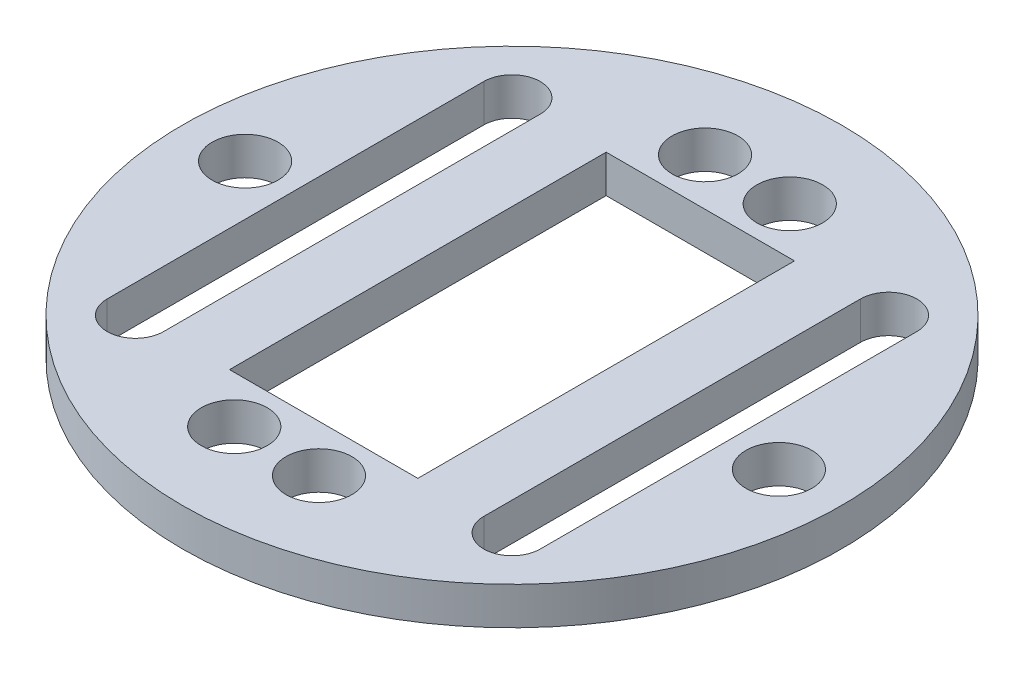
ISO-10303-21;
HEADER;
FILE_DESCRIPTION(('STEP AP214'),'2;1');
FILE_NAME('part.step','',(''),(''),'','','');
FILE_SCHEMA(('AUTOMOTIVE_DESIGN { 1 0 10303 214 1 1 1 1 }'));
ENDSEC;
DATA;
#1=APPLICATION_CONTEXT('core data for automotive mechanical design processes');
#2=APPLICATION_PROTOCOL_DEFINITION('international standard','automotive_design',2000,#1);
#3=PRODUCT_CONTEXT('',#1,'mechanical');
#4=PRODUCT('Part','Part','',(#3));
#5=PRODUCT_RELATED_PRODUCT_CATEGORY('part','',(#4));
#6=PRODUCT_DEFINITION_FORMATION('','',#4);
#7=PRODUCT_DEFINITION_CONTEXT('part definition',#1,'design');
#8=PRODUCT_DEFINITION('design','',#6,#7);
#9=PRODUCT_DEFINITION_SHAPE('','',#8);
#10=(LENGTH_UNIT() NAMED_UNIT(*) SI_UNIT(.MILLI.,.METRE.));
#11=(NAMED_UNIT(*) PLANE_ANGLE_UNIT() SI_UNIT($,.RADIAN.));
#12=(NAMED_UNIT(*) SI_UNIT($,.STERADIAN.) SOLID_ANGLE_UNIT());
#13=UNCERTAINTY_MEASURE_WITH_UNIT(LENGTH_MEASURE(1.E-05),#10,'distance_accuracy_value','');
#14=(GEOMETRIC_REPRESENTATION_CONTEXT(3) GLOBAL_UNCERTAINTY_ASSIGNED_CONTEXT((#13)) GLOBAL_UNIT_ASSIGNED_CONTEXT((#10,
#11,#12)) REPRESENTATION_CONTEXT('',''));
#15=CARTESIAN_POINT('',(0.,0.,0.));
#16=DIRECTION('',(0.,0.,1.));
#17=DIRECTION('',(1.,0.,0.));
#18=AXIS2_PLACEMENT_3D('',#15,#16,#17);
#19=CARTESIAN_POINT('',(0.,4.,0.));
#20=DIRECTION('',(0.,1.,0.));
#21=DIRECTION('',(0.,0.,1.));
#22=AXIS2_PLACEMENT_3D('',#19,#20,#21);
#23=PLANE('',#22);
#24=DIRECTION('',(0.,0.,1.));
#25=VECTOR('',#24,1.);
#26=CARTESIAN_POINT('',(10.,4.,0.));
#27=LINE('',#26,#25);
#28=CARTESIAN_POINT('',(10.,4.,-20.));
#29=VERTEX_POINT('',#28);
#30=CARTESIAN_POINT('',(10.,4.,20.));
#31=VERTEX_POINT('',#30);
#32=EDGE_CURVE('E232',#29,#31,#27,.T.);
#33=ORIENTED_EDGE('',*,*,#32,.T.);
#34=DIRECTION('',(-1.,0.,0.));
#35=VECTOR('',#34,1.);
#36=CARTESIAN_POINT('',(0.,4.,20.));
#37=LINE('',#36,#35);
#38=CARTESIAN_POINT('',(-9.99999999999999,4.,20.));
#39=VERTEX_POINT('',#38);
#40=EDGE_CURVE('E235',#31,#39,#37,.T.);
#41=ORIENTED_EDGE('',*,*,#40,.T.);
#42=DIRECTION('',(0.,0.,1.));
#43=VECTOR('',#42,1.);
#44=CARTESIAN_POINT('',(-9.99999999999999,4.,0.));
#45=LINE('',#44,#43);
#46=CARTESIAN_POINT('',(-9.99999999999999,4.,-20.));
#47=VERTEX_POINT('',#46);
#48=EDGE_CURVE('E229',#47,#39,#45,.T.);
#49=ORIENTED_EDGE('',*,*,#48,.F.);
#50=DIRECTION('',(-1.,0.,0.));
#51=VECTOR('',#50,1.);
#52=CARTESIAN_POINT('',(0.,4.,-20.));
#53=LINE('',#52,#51);
#54=EDGE_CURVE('E126',#29,#47,#53,.T.);
#55=ORIENTED_EDGE('',*,*,#54,.F.);
#56=EDGE_LOOP('',(#33,#41,#49,#55));
#57=FACE_BOUND('',#56,.T.);
#58=CARTESIAN_POINT('',(4.5,4.,25.));
#59=DIRECTION('',(0.,1.,0.));
#60=DIRECTION('',(0.,0.,1.));
#61=AXIS2_PLACEMENT_3D('',#58,#59,#60);
#62=CIRCLE('',#61,3.5);
#63=CARTESIAN_POINT('',(4.5,4.,28.5));
#64=VERTEX_POINT('',#63);
#65=EDGE_CURVE('E211',#64,#64,#62,.F.);
#66=ORIENTED_EDGE('',*,*,#65,.T.);
#67=EDGE_LOOP('',(#66));
#68=FACE_BOUND('',#67,.T.);
#69=DIRECTION('',(0.,0.,-1.));
#70=VECTOR('',#69,1.);
#71=CARTESIAN_POINT('',(-23.,4.,0.));
#72=LINE('',#71,#70);
#73=CARTESIAN_POINT('',(-23.,4.,20.));
#74=VERTEX_POINT('',#73);
#75=CARTESIAN_POINT('',(-23.,4.,-20.));
#76=VERTEX_POINT('',#75);
#77=EDGE_CURVE('E199',#74,#76,#72,.T.);
#78=ORIENTED_EDGE('',*,*,#77,.T.);
#79=CARTESIAN_POINT('',(-20.,4.,-20.));
#80=DIRECTION('',(0.,1.,0.));
#81=DIRECTION('',(0.,0.,1.));
#82=AXIS2_PLACEMENT_3D('',#79,#80,#81);
#83=CIRCLE('',#82,3.);
#84=CARTESIAN_POINT('',(-17.,4.,-20.));
#85=VERTEX_POINT('',#84);
#86=EDGE_CURVE('E202',#76,#85,#83,.F.);
#87=ORIENTED_EDGE('',*,*,#86,.T.);
#88=DIRECTION('',(0.,0.,-1.));
#89=VECTOR('',#88,1.);
#90=CARTESIAN_POINT('',(-17.,4.,0.));
#91=LINE('',#90,#89);
#92=CARTESIAN_POINT('',(-17.,4.,20.));
#93=VERTEX_POINT('',#92);
#94=EDGE_CURVE('E194',#93,#85,#91,.T.);
#95=ORIENTED_EDGE('',*,*,#94,.F.);
#96=CARTESIAN_POINT('',(-20.,4.,20.));
#97=DIRECTION('',(0.,1.,0.));
#98=DIRECTION('',(0.,0.,1.));
#99=AXIS2_PLACEMENT_3D('',#96,#97,#98);
#100=CIRCLE('',#99,3.);
#101=EDGE_CURVE('E196',#93,#74,#100,.F.);
#102=ORIENTED_EDGE('',*,*,#101,.T.);
#103=EDGE_LOOP('',(#78,#87,#95,#102));
#104=FACE_BOUND('',#103,.T.);
#105=CARTESIAN_POINT('',(0.,4.,0.));
#106=DIRECTION('',(0.,1.,0.));
#107=DIRECTION('',(0.,0.,1.));
#108=AXIS2_PLACEMENT_3D('',#105,#106,#107);
#109=CIRCLE('',#108,35.);
#110=CARTESIAN_POINT('',(0.,4.,35.));
#111=VERTEX_POINT('',#110);
#112=EDGE_CURVE('E11',#111,#111,#109,.T.);
#113=ORIENTED_EDGE('',*,*,#112,.T.);
#114=EDGE_LOOP('',(#113));
#115=FACE_BOUND('',#114,.T.);
#116=CARTESIAN_POINT('',(4.5,4.,-25.));
#117=DIRECTION('',(0.,1.,0.));
#118=DIRECTION('',(0.,0.,1.));
#119=AXIS2_PLACEMENT_3D('',#116,#117,#118);
#120=CIRCLE('',#119,3.5);
#121=CARTESIAN_POINT('',(4.5,4.,-21.5));
#122=VERTEX_POINT('',#121);
#123=EDGE_CURVE('E205',#122,#122,#120,.T.);
#124=ORIENTED_EDGE('',*,*,#123,.F.);
#125=EDGE_LOOP('',(#124));
#126=FACE_BOUND('',#125,.T.);
#127=CARTESIAN_POINT('',(-4.5,4.,-25.));
#128=DIRECTION('',(0.,1.,0.));
#129=DIRECTION('',(0.,0.,1.));
#130=AXIS2_PLACEMENT_3D('',#127,#128,#129);
#131=CIRCLE('',#130,3.5);
#132=CARTESIAN_POINT('',(-4.5,4.,-21.5));
#133=VERTEX_POINT('',#132);
#134=EDGE_CURVE('E208',#133,#133,#131,.F.);
#135=ORIENTED_EDGE('',*,*,#134,.T.);
#136=EDGE_LOOP('',(#135));
#137=FACE_BOUND('',#136,.T.);
#138=CARTESIAN_POINT('',(-4.5,4.,25.));
#139=DIRECTION('',(0.,1.,0.));
#140=DIRECTION('',(0.,0.,1.));
#141=AXIS2_PLACEMENT_3D('',#138,#139,#140);
#142=CIRCLE('',#141,3.5);
#143=CARTESIAN_POINT('',(-4.5,4.,28.5));
#144=VERTEX_POINT('',#143);
#145=EDGE_CURVE('E214',#144,#144,#142,.T.);
#146=ORIENTED_EDGE('',*,*,#145,.F.);
#147=EDGE_LOOP('',(#146));
#148=FACE_BOUND('',#147,.T.);
#149=CARTESIAN_POINT('',(28.3467060544646,4.,0.));
#150=DIRECTION('',(0.,1.,0.));
#151=DIRECTION('',(0.,0.,1.));
#152=AXIS2_PLACEMENT_3D('',#149,#150,#151);
#153=CIRCLE('',#152,3.5);
#154=CARTESIAN_POINT('',(28.3467060544646,4.,3.5));
#155=VERTEX_POINT('',#154);
#156=EDGE_CURVE('E217',#155,#155,#153,.T.);
#157=ORIENTED_EDGE('',*,*,#156,.F.);
#158=EDGE_LOOP('',(#157));
#159=FACE_BOUND('',#158,.T.);
#160=CARTESIAN_POINT('',(20.,4.,-20.));
#161=DIRECTION('',(0.,1.,0.));
#162=DIRECTION('',(0.,0.,1.));
#163=AXIS2_PLACEMENT_3D('',#160,#161,#162);
#164=CIRCLE('',#163,3.);
#165=CARTESIAN_POINT('',(23.,4.,-20.));
#166=VERTEX_POINT('',#165);
#167=CARTESIAN_POINT('',(17.,4.,-20.));
#168=VERTEX_POINT('',#167);
#169=EDGE_CURVE('E227',#166,#168,#164,.T.);
#170=ORIENTED_EDGE('',*,*,#169,.F.);
#171=DIRECTION('',(0.,0.,-1.));
#172=VECTOR('',#171,1.);
#173=CARTESIAN_POINT('',(23.,4.,0.));
#174=LINE('',#173,#172);
#175=CARTESIAN_POINT('',(23.,4.,20.));
#176=VERTEX_POINT('',#175);
#177=EDGE_CURVE('E220',#176,#166,#174,.T.);
#178=ORIENTED_EDGE('',*,*,#177,.F.);
#179=CARTESIAN_POINT('',(20.,4.,20.));
#180=DIRECTION('',(0.,1.,0.));
#181=DIRECTION('',(0.,0.,1.));
#182=AXIS2_PLACEMENT_3D('',#179,#180,#181);
#183=CIRCLE('',#182,3.);
#184=CARTESIAN_POINT('',(17.,4.,20.));
#185=VERTEX_POINT('',#184);
#186=EDGE_CURVE('E222',#185,#176,#183,.T.);
#187=ORIENTED_EDGE('',*,*,#186,.F.);
#188=DIRECTION('',(0.,0.,-1.));
#189=VECTOR('',#188,1.);
#190=CARTESIAN_POINT('',(17.,4.,0.));
#191=LINE('',#190,#189);
#192=EDGE_CURVE('E224',#185,#168,#191,.T.);
#193=ORIENTED_EDGE('',*,*,#192,.T.);
#194=EDGE_LOOP('',(#170,#178,#187,#193));
#195=FACE_BOUND('',#194,.T.);
#196=CARTESIAN_POINT('',(-28.3467060544646,4.,0.));
#197=DIRECTION('',(0.,1.,0.));
#198=DIRECTION('',(0.,0.,1.));
#199=AXIS2_PLACEMENT_3D('',#196,#197,#198);
#200=CIRCLE('',#199,3.5);
#201=CARTESIAN_POINT('',(-28.3467060544646,4.,3.5));
#202=VERTEX_POINT('',#201);
#203=EDGE_CURVE('E238',#202,#202,#200,.F.);
#204=ORIENTED_EDGE('',*,*,#203,.T.);
#205=EDGE_LOOP('',(#204));
#206=FACE_BOUND('',#205,.T.);
#207=ADVANCED_FACE('F32',(#57,#68,#104,#115,#126,#137,#148,#159,#195,#206),#23,.T.);
#208=CARTESIAN_POINT('',(0.,0.,0.));
#209=DIRECTION('',(0.,1.,0.));
#210=DIRECTION('',(0.,0.,1.));
#211=AXIS2_PLACEMENT_3D('',#208,#209,#210);
#212=PLANE('',#211);
#213=CARTESIAN_POINT('',(4.5,0.,25.));
#214=DIRECTION('',(0.,1.,0.));
#215=DIRECTION('',(0.,0.,1.));
#216=AXIS2_PLACEMENT_3D('',#213,#214,#215);
#217=CIRCLE('',#216,3.5);
#218=CARTESIAN_POINT('',(4.5,0.,28.5));
#219=VERTEX_POINT('',#218);
#220=EDGE_CURVE('E480',#219,#219,#217,.T.);
#221=ORIENTED_EDGE('',*,*,#220,.T.);
#222=EDGE_LOOP('',(#221));
#223=FACE_BOUND('',#222,.T.);
#224=CARTESIAN_POINT('',(-4.5,0.,-25.));
#225=DIRECTION('',(0.,1.,0.));
#226=DIRECTION('',(0.,0.,1.));
#227=AXIS2_PLACEMENT_3D('',#224,#225,#226);
#228=CIRCLE('',#227,3.5);
#229=CARTESIAN_POINT('',(-4.5,0.,-21.5));
#230=VERTEX_POINT('',#229);
#231=EDGE_CURVE('E478',#230,#230,#228,.T.);
#232=ORIENTED_EDGE('',*,*,#231,.T.);
#233=EDGE_LOOP('',(#232));
#234=FACE_BOUND('',#233,.T.);
#235=CARTESIAN_POINT('',(-20.,0.,-20.));
#236=DIRECTION('',(0.,1.,0.));
#237=DIRECTION('',(0.,0.,1.));
#238=AXIS2_PLACEMENT_3D('',#235,#236,#237);
#239=CIRCLE('',#238,3.);
#240=CARTESIAN_POINT('',(-17.,0.,-20.));
#241=VERTEX_POINT('',#240);
#242=CARTESIAN_POINT('',(-23.,0.,-20.));
#243=VERTEX_POINT('',#242);
#244=EDGE_CURVE('E173',#241,#243,#239,.T.);
#245=ORIENTED_EDGE('',*,*,#244,.T.);
#246=DIRECTION('',(0.,0.,1.));
#247=VECTOR('',#246,1.);
#248=CARTESIAN_POINT('',(-23.,0.,-20.));
#249=LINE('',#248,#247);
#250=CARTESIAN_POINT('',(-23.,0.,20.));
#251=VERTEX_POINT('',#250);
#252=EDGE_CURVE('E176',#243,#251,#249,.T.);
#253=ORIENTED_EDGE('',*,*,#252,.T.);
#254=CARTESIAN_POINT('',(-20.,0.,20.));
#255=DIRECTION('',(0.,1.,0.));
#256=DIRECTION('',(0.,0.,1.));
#257=AXIS2_PLACEMENT_3D('',#254,#255,#256);
#258=CIRCLE('',#257,3.);
#259=CARTESIAN_POINT('',(-17.,0.,20.));
#260=VERTEX_POINT('',#259);
#261=EDGE_CURVE('E179',#251,#260,#258,.T.);
#262=ORIENTED_EDGE('',*,*,#261,.T.);
#263=DIRECTION('',(0.,0.,1.));
#264=VECTOR('',#263,1.);
#265=CARTESIAN_POINT('',(-17.,0.,-20.));
#266=LINE('',#265,#264);
#267=EDGE_CURVE('E182',#241,#260,#266,.T.);
#268=ORIENTED_EDGE('',*,*,#267,.F.);
#269=EDGE_LOOP('',(#245,#253,#262,#268));
#270=FACE_BOUND('',#269,.T.);
#271=CARTESIAN_POINT('',(0.,0.,0.));
#272=DIRECTION('',(0.,1.,0.));
#273=DIRECTION('',(0.,0.,1.));
#274=AXIS2_PLACEMENT_3D('',#271,#272,#273);
#275=CIRCLE('',#274,35.);
#276=CARTESIAN_POINT('',(0.,0.,35.));
#277=VERTEX_POINT('',#276);
#278=EDGE_CURVE('E36',#277,#277,#275,.T.);
#279=ORIENTED_EDGE('',*,*,#278,.F.);
#280=EDGE_LOOP('',(#279));
#281=FACE_BOUND('',#280,.T.);
#282=CARTESIAN_POINT('',(4.5,0.,-25.));
#283=DIRECTION('',(0.,-1.,0.));
#284=DIRECTION('',(0.,0.,-1.));
#285=AXIS2_PLACEMENT_3D('',#282,#283,#284);
#286=CIRCLE('',#285,3.5);
#287=CARTESIAN_POINT('',(4.5,0.,-28.5));
#288=VERTEX_POINT('',#287);
#289=EDGE_CURVE('E252',#288,#288,#286,.T.);
#290=ORIENTED_EDGE('',*,*,#289,.F.);
#291=EDGE_LOOP('',(#290));
#292=FACE_BOUND('',#291,.T.);
#293=CARTESIAN_POINT('',(-4.5,0.,25.));
#294=DIRECTION('',(0.,-1.,0.));
#295=DIRECTION('',(0.,0.,-1.));
#296=AXIS2_PLACEMENT_3D('',#293,#294,#295);
#297=CIRCLE('',#296,3.5);
#298=CARTESIAN_POINT('',(-4.5,0.,21.5));
#299=VERTEX_POINT('',#298);
#300=EDGE_CURVE('E172',#299,#299,#297,.T.);
#301=ORIENTED_EDGE('',*,*,#300,.F.);
#302=EDGE_LOOP('',(#301));
#303=FACE_BOUND('',#302,.T.);
#304=CARTESIAN_POINT('',(28.3467060544646,0.,0.));
#305=DIRECTION('',(0.,-1.,0.));
#306=DIRECTION('',(0.,0.,-1.));
#307=AXIS2_PLACEMENT_3D('',#304,#305,#306);
#308=CIRCLE('',#307,3.5);
#309=CARTESIAN_POINT('',(28.3467060544646,0.,-3.5));
#310=VERTEX_POINT('',#309);
#311=EDGE_CURVE('E159',#310,#310,#308,.T.);
#312=ORIENTED_EDGE('',*,*,#311,.F.);
#313=EDGE_LOOP('',(#312));
#314=FACE_BOUND('',#313,.T.);
#315=DIRECTION('',(0.,0.,1.));
#316=VECTOR('',#315,1.);
#317=CARTESIAN_POINT('',(23.,0.,-20.));
#318=LINE('',#317,#316);
#319=CARTESIAN_POINT('',(23.,0.,-20.));
#320=VERTEX_POINT('',#319);
#321=CARTESIAN_POINT('',(23.,0.,20.));
#322=VERTEX_POINT('',#321);
#323=EDGE_CURVE('E165',#320,#322,#318,.T.);
#324=ORIENTED_EDGE('',*,*,#323,.F.);
#325=CARTESIAN_POINT('',(20.,0.,-20.));
#326=DIRECTION('',(0.,-1.,0.));
#327=DIRECTION('',(0.,0.,-1.));
#328=AXIS2_PLACEMENT_3D('',#325,#326,#327);
#329=CIRCLE('',#328,3.);
#330=CARTESIAN_POINT('',(17.,0.,-20.));
#331=VERTEX_POINT('',#330);
#332=EDGE_CURVE('E167',#331,#320,#329,.T.);
#333=ORIENTED_EDGE('',*,*,#332,.F.);
#334=DIRECTION('',(0.,0.,1.));
#335=VECTOR('',#334,1.);
#336=CARTESIAN_POINT('',(17.,0.,-20.));
#337=LINE('',#336,#335);
#338=CARTESIAN_POINT('',(17.,0.,20.));
#339=VERTEX_POINT('',#338);
#340=EDGE_CURVE('E153',#331,#339,#337,.T.);
#341=ORIENTED_EDGE('',*,*,#340,.T.);
#342=CARTESIAN_POINT('',(20.,0.,20.));
#343=DIRECTION('',(0.,-1.,0.));
#344=DIRECTION('',(0.,0.,-1.));
#345=AXIS2_PLACEMENT_3D('',#342,#343,#344);
#346=CIRCLE('',#345,3.);
#347=EDGE_CURVE('E162',#322,#339,#346,.T.);
#348=ORIENTED_EDGE('',*,*,#347,.F.);
#349=EDGE_LOOP('',(#324,#333,#341,#348));
#350=FACE_BOUND('',#349,.T.);
#351=DIRECTION('',(1.,0.,0.));
#352=VECTOR('',#351,1.);
#353=CARTESIAN_POINT('',(-9.99999999999999,0.,20.));
#354=LINE('',#353,#352);
#355=CARTESIAN_POINT('',(-9.99999999999999,0.,20.));
#356=VERTEX_POINT('',#355);
#357=CARTESIAN_POINT('',(10.,0.,20.));
#358=VERTEX_POINT('',#357);
#359=EDGE_CURVE('E144',#356,#358,#354,.T.);
#360=ORIENTED_EDGE('',*,*,#359,.T.);
#361=DIRECTION('',(0.,0.,-1.));
#362=VECTOR('',#361,1.);
#363=CARTESIAN_POINT('',(10.,0.,20.));
#364=LINE('',#363,#362);
#365=CARTESIAN_POINT('',(10.,0.,-20.));
#366=VERTEX_POINT('',#365);
#367=EDGE_CURVE('E142',#358,#366,#364,.T.);
#368=ORIENTED_EDGE('',*,*,#367,.T.);
#369=DIRECTION('',(1.,0.,0.));
#370=VECTOR('',#369,1.);
#371=CARTESIAN_POINT('',(-9.99999999999999,0.,-20.));
#372=LINE('',#371,#370);
#373=CARTESIAN_POINT('',(-9.99999999999999,0.,-20.));
#374=VERTEX_POINT('',#373);
#375=EDGE_CURVE('E123',#374,#366,#372,.T.);
#376=ORIENTED_EDGE('',*,*,#375,.F.);
#377=DIRECTION('',(0.,0.,-1.));
#378=VECTOR('',#377,1.);
#379=CARTESIAN_POINT('',(-9.99999999999999,0.,20.));
#380=LINE('',#379,#378);
#381=EDGE_CURVE('E133',#356,#374,#380,.T.);
#382=ORIENTED_EDGE('',*,*,#381,.F.);
#383=EDGE_LOOP('',(#360,#368,#376,#382));
#384=FACE_BOUND('',#383,.T.);
#385=CARTESIAN_POINT('',(-28.3467060544646,0.,0.));
#386=DIRECTION('',(0.,1.,0.));
#387=DIRECTION('',(0.,0.,1.));
#388=AXIS2_PLACEMENT_3D('',#385,#386,#387);
#389=CIRCLE('',#388,3.5);
#390=CARTESIAN_POINT('',(-28.3467060544646,0.,3.5));
#391=VERTEX_POINT('',#390);
#392=EDGE_CURVE('E149',#391,#391,#389,.T.);
#393=ORIENTED_EDGE('',*,*,#392,.T.);
#394=EDGE_LOOP('',(#393));
#395=FACE_BOUND('',#394,.T.);
#396=ADVANCED_FACE('F139',(#223,#234,#270,#281,#292,#303,#314,#350,#384,#395),#212,.F.);
#397=CARTESIAN_POINT('',(0.,4.,0.));
#398=DIRECTION('',(0.,-1.,0.));
#399=DIRECTION('',(0.,0.,-1.));
#400=AXIS2_PLACEMENT_3D('',#397,#398,#399);
#401=CYLINDRICAL_SURFACE('',#400,35.);
#402=ORIENTED_EDGE('',*,*,#112,.F.);
#403=EDGE_LOOP('',(#402));
#404=FACE_BOUND('',#403,.T.);
#405=ORIENTED_EDGE('',*,*,#278,.T.);
#406=EDGE_LOOP('',(#405));
#407=FACE_BOUND('',#406,.T.);
#408=ADVANCED_FACE('F34',(#404,#407),#401,.T.);
#409=CARTESIAN_POINT('',(-20.,5.,-20.));
#410=DIRECTION('',(0.,-1.,0.));
#411=DIRECTION('',(0.,0.,-1.));
#412=AXIS2_PLACEMENT_3D('',#409,#410,#411);
#413=CYLINDRICAL_SURFACE('',#412,3.);
#414=DIRECTION('',(0.,-1.,0.));
#415=VECTOR('',#414,1.);
#416=CARTESIAN_POINT('',(-23.,5.,-20.));
#417=LINE('',#416,#415);
#418=EDGE_CURVE('E192',#76,#243,#417,.T.);
#419=ORIENTED_EDGE('',*,*,#418,.T.);
#420=ORIENTED_EDGE('',*,*,#244,.F.);
#421=DIRECTION('',(0.,-1.,0.));
#422=VECTOR('',#421,1.);
#423=CARTESIAN_POINT('',(-17.,5.,-20.));
#424=LINE('',#423,#422);
#425=EDGE_CURVE('E185',#85,#241,#424,.T.);
#426=ORIENTED_EDGE('',*,*,#425,.F.);
#427=ORIENTED_EDGE('',*,*,#86,.F.);
#428=EDGE_LOOP('',(#419,#420,#426,#427));
#429=FACE_BOUND('',#428,.T.);
#430=ADVANCED_FACE('F292',(#429),#413,.F.);
#431=CARTESIAN_POINT('',(-23.,5.,-20.));
#432=DIRECTION('',(1.,0.,0.));
#433=DIRECTION('',(0.,0.,-1.));
#434=AXIS2_PLACEMENT_3D('',#431,#432,#433);
#435=PLANE('',#434);
#436=DIRECTION('',(0.,-1.,0.));
#437=VECTOR('',#436,1.);
#438=CARTESIAN_POINT('',(-23.,5.,20.));
#439=LINE('',#438,#437);
#440=EDGE_CURVE('E190',#74,#251,#439,.T.);
#441=ORIENTED_EDGE('',*,*,#440,.T.);
#442=ORIENTED_EDGE('',*,*,#252,.F.);
#443=ORIENTED_EDGE('',*,*,#418,.F.);
#444=ORIENTED_EDGE('',*,*,#77,.F.);
#445=EDGE_LOOP('',(#441,#442,#443,#444));
#446=FACE_BOUND('',#445,.T.);
#447=ADVANCED_FACE('F295',(#446),#435,.T.);
#448=CARTESIAN_POINT('',(-20.,5.,20.));
#449=DIRECTION('',(0.,-1.,0.));
#450=DIRECTION('',(0.,0.,-1.));
#451=AXIS2_PLACEMENT_3D('',#448,#449,#450);
#452=CYLINDRICAL_SURFACE('',#451,3.);
#453=DIRECTION('',(0.,-1.,0.));
#454=VECTOR('',#453,1.);
#455=CARTESIAN_POINT('',(-17.,5.,20.));
#456=LINE('',#455,#454);
#457=EDGE_CURVE('E188',#93,#260,#456,.T.);
#458=ORIENTED_EDGE('',*,*,#457,.T.);
#459=ORIENTED_EDGE('',*,*,#261,.F.);
#460=ORIENTED_EDGE('',*,*,#440,.F.);
#461=ORIENTED_EDGE('',*,*,#101,.F.);
#462=EDGE_LOOP('',(#458,#459,#460,#461));
#463=FACE_BOUND('',#462,.T.);
#464=ADVANCED_FACE('F299',(#463),#452,.F.);
#465=CARTESIAN_POINT('',(-17.,5.,-20.));
#466=DIRECTION('',(1.,0.,0.));
#467=DIRECTION('',(0.,0.,-1.));
#468=AXIS2_PLACEMENT_3D('',#465,#466,#467);
#469=PLANE('',#468);
#470=ORIENTED_EDGE('',*,*,#94,.T.);
#471=ORIENTED_EDGE('',*,*,#425,.T.);
#472=ORIENTED_EDGE('',*,*,#267,.T.);
#473=ORIENTED_EDGE('',*,*,#457,.F.);
#474=EDGE_LOOP('',(#470,#471,#472,#473));
#475=FACE_BOUND('',#474,.T.);
#476=ADVANCED_FACE('F303',(#475),#469,.F.);
#477=CARTESIAN_POINT('',(4.5,5.,-25.));
#478=DIRECTION('',(0.,-1.,0.));
#479=DIRECTION('',(0.,0.,-1.));
#480=AXIS2_PLACEMENT_3D('',#477,#478,#479);
#481=CYLINDRICAL_SURFACE('',#480,3.5);
#482=ORIENTED_EDGE('',*,*,#123,.T.);
#483=EDGE_LOOP('',(#482));
#484=FACE_BOUND('',#483,.T.);
#485=ORIENTED_EDGE('',*,*,#289,.T.);
#486=EDGE_LOOP('',(#485));
#487=FACE_BOUND('',#486,.T.);
#488=ADVANCED_FACE('F307',(#484,#487),#481,.F.);
#489=CARTESIAN_POINT('',(-4.5,5.,-25.));
#490=DIRECTION('',(0.,-1.,0.));
#491=DIRECTION('',(0.,0.,-1.));
#492=AXIS2_PLACEMENT_3D('',#489,#490,#491);
#493=CYLINDRICAL_SURFACE('',#492,3.5);
#494=ORIENTED_EDGE('',*,*,#134,.F.);
#495=EDGE_LOOP('',(#494));
#496=FACE_BOUND('',#495,.T.);
#497=ORIENTED_EDGE('',*,*,#231,.F.);
#498=EDGE_LOOP('',(#497));
#499=FACE_BOUND('',#498,.T.);
#500=ADVANCED_FACE('F327',(#496,#499),#493,.F.);
#501=CARTESIAN_POINT('',(4.5,5.,25.));
#502=DIRECTION('',(0.,-1.,0.));
#503=DIRECTION('',(0.,0.,-1.));
#504=AXIS2_PLACEMENT_3D('',#501,#502,#503);
#505=CYLINDRICAL_SURFACE('',#504,3.5);
#506=ORIENTED_EDGE('',*,*,#65,.F.);
#507=EDGE_LOOP('',(#506));
#508=FACE_BOUND('',#507,.T.);
#509=ORIENTED_EDGE('',*,*,#220,.F.);
#510=EDGE_LOOP('',(#509));
#511=FACE_BOUND('',#510,.T.);
#512=ADVANCED_FACE('F318',(#508,#511),#505,.F.);
#513=CARTESIAN_POINT('',(-4.5,5.,25.));
#514=DIRECTION('',(0.,-1.,0.));
#515=DIRECTION('',(0.,0.,-1.));
#516=AXIS2_PLACEMENT_3D('',#513,#514,#515);
#517=CYLINDRICAL_SURFACE('',#516,3.5);
#518=ORIENTED_EDGE('',*,*,#145,.T.);
#519=EDGE_LOOP('',(#518));
#520=FACE_BOUND('',#519,.T.);
#521=ORIENTED_EDGE('',*,*,#300,.T.);
#522=EDGE_LOOP('',(#521));
#523=FACE_BOUND('',#522,.T.);
#524=ADVANCED_FACE('F311',(#520,#523),#517,.F.);
#525=CARTESIAN_POINT('',(28.3467060544646,5.,0.));
#526=DIRECTION('',(0.,-1.,0.));
#527=DIRECTION('',(0.,0.,-1.));
#528=AXIS2_PLACEMENT_3D('',#525,#526,#527);
#529=CYLINDRICAL_SURFACE('',#528,3.5);
#530=ORIENTED_EDGE('',*,*,#156,.T.);
#531=EDGE_LOOP('',(#530));
#532=FACE_BOUND('',#531,.T.);
#533=ORIENTED_EDGE('',*,*,#311,.T.);
#534=EDGE_LOOP('',(#533));
#535=FACE_BOUND('',#534,.T.);
#536=ADVANCED_FACE('F309',(#532,#535),#529,.F.);
#537=CARTESIAN_POINT('',(20.,5.,-20.));
#538=DIRECTION('',(0.,-1.,0.));
#539=DIRECTION('',(0.,0.,-1.));
#540=AXIS2_PLACEMENT_3D('',#537,#538,#539);
#541=CYLINDRICAL_SURFACE('',#540,3.);
#542=ORIENTED_EDGE('',*,*,#169,.T.);
#543=DIRECTION('',(0.,-1.,0.));
#544=VECTOR('',#543,1.);
#545=CARTESIAN_POINT('',(17.,5.,-20.));
#546=LINE('',#545,#544);
#547=EDGE_CURVE('E157',#168,#331,#546,.T.);
#548=ORIENTED_EDGE('',*,*,#547,.T.);
#549=ORIENTED_EDGE('',*,*,#332,.T.);
#550=DIRECTION('',(0.,-1.,0.));
#551=VECTOR('',#550,1.);
#552=CARTESIAN_POINT('',(23.,5.,-20.));
#553=LINE('',#552,#551);
#554=EDGE_CURVE('E150',#166,#320,#553,.T.);
#555=ORIENTED_EDGE('',*,*,#554,.F.);
#556=EDGE_LOOP('',(#542,#548,#549,#555));
#557=FACE_BOUND('',#556,.T.);
#558=ADVANCED_FACE('F266',(#557),#541,.F.);
#559=CARTESIAN_POINT('',(17.,5.,-20.));
#560=DIRECTION('',(1.,0.,0.));
#561=DIRECTION('',(0.,0.,-1.));
#562=AXIS2_PLACEMENT_3D('',#559,#560,#561);
#563=PLANE('',#562);
#564=DIRECTION('',(0.,-1.,0.));
#565=VECTOR('',#564,1.);
#566=CARTESIAN_POINT('',(17.,5.,20.));
#567=LINE('',#566,#565);
#568=EDGE_CURVE('E155',#185,#339,#567,.T.);
#569=ORIENTED_EDGE('',*,*,#568,.T.);
#570=ORIENTED_EDGE('',*,*,#340,.F.);
#571=ORIENTED_EDGE('',*,*,#547,.F.);
#572=ORIENTED_EDGE('',*,*,#192,.F.);
#573=EDGE_LOOP('',(#569,#570,#571,#572));
#574=FACE_BOUND('',#573,.T.);
#575=ADVANCED_FACE('F272',(#574),#563,.T.);
#576=CARTESIAN_POINT('',(20.,5.,20.));
#577=DIRECTION('',(0.,-1.,0.));
#578=DIRECTION('',(0.,0.,-1.));
#579=AXIS2_PLACEMENT_3D('',#576,#577,#578);
#580=CYLINDRICAL_SURFACE('',#579,3.);
#581=ORIENTED_EDGE('',*,*,#186,.T.);
#582=DIRECTION('',(0.,-1.,0.));
#583=VECTOR('',#582,1.);
#584=CARTESIAN_POINT('',(23.,5.,20.));
#585=LINE('',#584,#583);
#586=EDGE_CURVE('E55',#176,#322,#585,.T.);
#587=ORIENTED_EDGE('',*,*,#586,.T.);
#588=ORIENTED_EDGE('',*,*,#347,.T.);
#589=ORIENTED_EDGE('',*,*,#568,.F.);
#590=EDGE_LOOP('',(#581,#587,#588,#589));
#591=FACE_BOUND('',#590,.T.);
#592=ADVANCED_FACE('F275',(#591),#580,.F.);
#593=CARTESIAN_POINT('',(23.,5.,-20.));
#594=DIRECTION('',(1.,0.,0.));
#595=DIRECTION('',(0.,0.,-1.));
#596=AXIS2_PLACEMENT_3D('',#593,#594,#595);
#597=PLANE('',#596);
#598=ORIENTED_EDGE('',*,*,#177,.T.);
#599=ORIENTED_EDGE('',*,*,#554,.T.);
#600=ORIENTED_EDGE('',*,*,#323,.T.);
#601=ORIENTED_EDGE('',*,*,#586,.F.);
#602=EDGE_LOOP('',(#598,#599,#600,#601));
#603=FACE_BOUND('',#602,.T.);
#604=ADVANCED_FACE('F261',(#603),#597,.F.);
#605=CARTESIAN_POINT('',(-9.99999999999999,5.,20.));
#606=DIRECTION('',(0.,0.,-1.));
#607=DIRECTION('',(-1.,0.,0.));
#608=AXIS2_PLACEMENT_3D('',#605,#606,#607);
#609=PLANE('',#608);
#610=DIRECTION('',(0.,-1.,0.));
#611=VECTOR('',#610,1.);
#612=CARTESIAN_POINT('',(10.,5.,20.));
#613=LINE('',#612,#611);
#614=EDGE_CURVE('E169',#31,#358,#613,.T.);
#615=ORIENTED_EDGE('',*,*,#614,.T.);
#616=ORIENTED_EDGE('',*,*,#359,.F.);
#617=DIRECTION('',(0.,-1.,0.));
#618=VECTOR('',#617,1.);
#619=CARTESIAN_POINT('',(-9.99999999999999,5.,20.));
#620=LINE('',#619,#618);
#621=EDGE_CURVE('E128',#39,#356,#620,.T.);
#622=ORIENTED_EDGE('',*,*,#621,.F.);
#623=ORIENTED_EDGE('',*,*,#40,.F.);
#624=EDGE_LOOP('',(#615,#616,#622,#623));
#625=FACE_BOUND('',#624,.T.);
#626=ADVANCED_FACE('F282',(#625),#609,.T.);
#627=CARTESIAN_POINT('',(10.,5.,20.));
#628=DIRECTION('',(-1.,0.,0.));
#629=DIRECTION('',(0.,0.,1.));
#630=AXIS2_PLACEMENT_3D('',#627,#628,#629);
#631=PLANE('',#630);
#632=DIRECTION('',(0.,-1.,0.));
#633=VECTOR('',#632,1.);
#634=CARTESIAN_POINT('',(10.,5.,-20.));
#635=LINE('',#634,#633);
#636=EDGE_CURVE('E129',#29,#366,#635,.T.);
#637=ORIENTED_EDGE('',*,*,#636,.T.);
#638=ORIENTED_EDGE('',*,*,#367,.F.);
#639=ORIENTED_EDGE('',*,*,#614,.F.);
#640=ORIENTED_EDGE('',*,*,#32,.F.);
#641=EDGE_LOOP('',(#637,#638,#639,#640));
#642=FACE_BOUND('',#641,.T.);
#643=ADVANCED_FACE('F344',(#642),#631,.T.);
#644=CARTESIAN_POINT('',(-9.99999999999999,5.,-20.));
#645=DIRECTION('',(0.,0.,-1.));
#646=DIRECTION('',(-1.,0.,0.));
#647=AXIS2_PLACEMENT_3D('',#644,#645,#646);
#648=PLANE('',#647);
#649=ORIENTED_EDGE('',*,*,#54,.T.);
#650=DIRECTION('',(0.,-1.,0.));
#651=VECTOR('',#650,1.);
#652=CARTESIAN_POINT('',(-9.99999999999999,5.,-20.));
#653=LINE('',#652,#651);
#654=EDGE_CURVE('E47',#47,#374,#653,.T.);
#655=ORIENTED_EDGE('',*,*,#654,.T.);
#656=ORIENTED_EDGE('',*,*,#375,.T.);
#657=ORIENTED_EDGE('',*,*,#636,.F.);
#658=EDGE_LOOP('',(#649,#655,#656,#657));
#659=FACE_BOUND('',#658,.T.);
#660=ADVANCED_FACE('F120',(#659),#648,.F.);
#661=CARTESIAN_POINT('',(-9.99999999999999,5.,20.));
#662=DIRECTION('',(-1.,0.,0.));
#663=DIRECTION('',(0.,0.,1.));
#664=AXIS2_PLACEMENT_3D('',#661,#662,#663);
#665=PLANE('',#664);
#666=ORIENTED_EDGE('',*,*,#48,.T.);
#667=ORIENTED_EDGE('',*,*,#621,.T.);
#668=ORIENTED_EDGE('',*,*,#381,.T.);
#669=ORIENTED_EDGE('',*,*,#654,.F.);
#670=EDGE_LOOP('',(#666,#667,#668,#669));
#671=FACE_BOUND('',#670,.T.);
#672=ADVANCED_FACE('F134',(#671),#665,.F.);
#673=CARTESIAN_POINT('',(-28.3467060544646,5.,0.));
#674=DIRECTION('',(0.,-1.,0.));
#675=DIRECTION('',(0.,0.,-1.));
#676=AXIS2_PLACEMENT_3D('',#673,#674,#675);
#677=CYLINDRICAL_SURFACE('',#676,3.5);
#678=ORIENTED_EDGE('',*,*,#203,.F.);
#679=EDGE_LOOP('',(#678));
#680=FACE_BOUND('',#679,.T.);
#681=ORIENTED_EDGE('',*,*,#392,.F.);
#682=EDGE_LOOP('',(#681));
#683=FACE_BOUND('',#682,.T.);
#684=ADVANCED_FACE('F338',(#680,#683),#677,.F.);
#685=CLOSED_SHELL('',(#207,#396,#408,#430,#447,#464,#476,#488,#500,#512,#524,#536,#558,#575,
#592,#604,#626,#643,#660,#672,#684));
#686=MANIFOLD_SOLID_BREP('B2',#685);
#687=ADVANCED_BREP_SHAPE_REPRESENTATION('',(#18,#686),#14);
#688=SHAPE_DEFINITION_REPRESENTATION(#9,#687);
ENDSEC;
END-ISO-10303-21;
